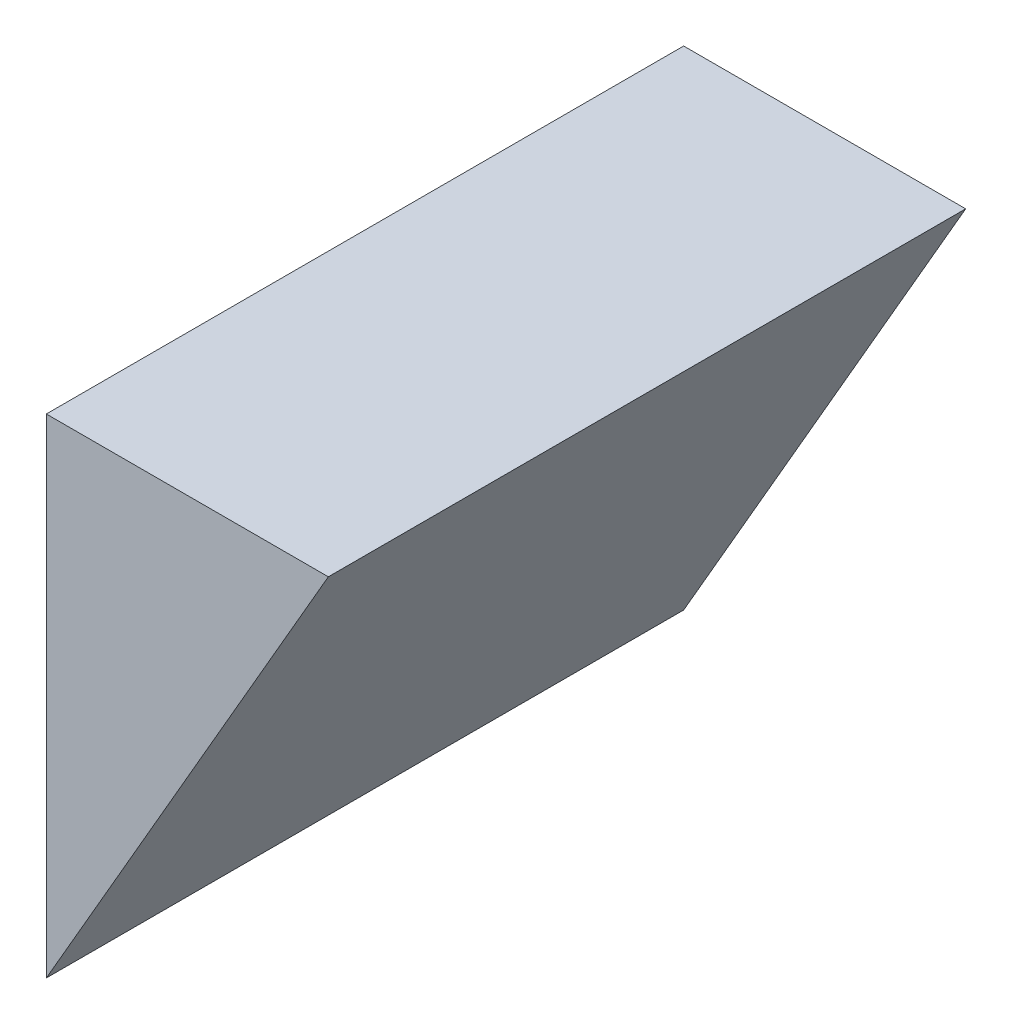
ISO-10303-21;
HEADER;
FILE_DESCRIPTION(('STEP AP214'),'2;1');
FILE_NAME('part.step','',(''),(''),'','','');
FILE_SCHEMA(('AUTOMOTIVE_DESIGN { 1 0 10303 214 1 1 1 1 }'));
ENDSEC;
DATA;
#1=APPLICATION_CONTEXT('core data for automotive mechanical design processes');
#2=APPLICATION_PROTOCOL_DEFINITION('international standard','automotive_design',2000,#1);
#3=PRODUCT_CONTEXT('',#1,'mechanical');
#4=PRODUCT('Part','Part','',(#3));
#5=PRODUCT_RELATED_PRODUCT_CATEGORY('part','',(#4));
#6=PRODUCT_DEFINITION_FORMATION('','',#4);
#7=PRODUCT_DEFINITION_CONTEXT('part definition',#1,'design');
#8=PRODUCT_DEFINITION('design','',#6,#7);
#9=PRODUCT_DEFINITION_SHAPE('','',#8);
#10=(LENGTH_UNIT() NAMED_UNIT(*) SI_UNIT(.MILLI.,.METRE.));
#11=(NAMED_UNIT(*) PLANE_ANGLE_UNIT() SI_UNIT($,.RADIAN.));
#12=(NAMED_UNIT(*) SI_UNIT($,.STERADIAN.) SOLID_ANGLE_UNIT());
#13=UNCERTAINTY_MEASURE_WITH_UNIT(LENGTH_MEASURE(1.E-05),#10,'distance_accuracy_value','');
#14=(GEOMETRIC_REPRESENTATION_CONTEXT(3) GLOBAL_UNCERTAINTY_ASSIGNED_CONTEXT((#13)) GLOBAL_UNIT_ASSIGNED_CONTEXT((#10,
#11,#12)) REPRESENTATION_CONTEXT('',''));
#15=CARTESIAN_POINT('',(0.,0.,0.));
#16=DIRECTION('',(0.,0.,1.));
#17=DIRECTION('',(1.,0.,0.));
#18=AXIS2_PLACEMENT_3D('',#15,#16,#17);
#19=CARTESIAN_POINT('',(17.39,0.,39.3));
#20=DIRECTION('',(0.,-1.,0.));
#21=DIRECTION('',(1.,0.,0.));
#22=AXIS2_PLACEMENT_3D('',#19,#20,#21);
#23=PLANE('',#22);
#24=DIRECTION('',(-1.,0.,0.));
#25=VECTOR('',#24,1.);
#26=CARTESIAN_POINT('',(17.39,0.,0.));
#27=LINE('',#26,#25);
#28=CARTESIAN_POINT('',(17.39,0.,0.));
#29=VERTEX_POINT('',#28);
#30=CARTESIAN_POINT('',(0.,0.,0.));
#31=VERTEX_POINT('',#30);
#32=EDGE_CURVE('E95',#29,#31,#27,.T.);
#33=ORIENTED_EDGE('',*,*,#32,.T.);
#34=DIRECTION('',(0.,0.,-1.));
#35=VECTOR('',#34,1.);
#36=CARTESIAN_POINT('',(0.,0.,39.3));
#37=LINE('',#36,#35);
#38=CARTESIAN_POINT('',(0.,0.,39.3));
#39=VERTEX_POINT('',#38);
#40=EDGE_CURVE('E11',#39,#31,#37,.T.);
#41=ORIENTED_EDGE('',*,*,#40,.F.);
#42=DIRECTION('',(-1.,0.,0.));
#43=VECTOR('',#42,1.);
#44=CARTESIAN_POINT('',(17.39,0.,39.3));
#45=LINE('',#44,#43);
#46=CARTESIAN_POINT('',(17.39,0.,39.3));
#47=VERTEX_POINT('',#46);
#48=EDGE_CURVE('E87',#47,#39,#45,.T.);
#49=ORIENTED_EDGE('',*,*,#48,.F.);
#50=DIRECTION('',(0.,0.,-1.));
#51=VECTOR('',#50,1.);
#52=CARTESIAN_POINT('',(17.39,0.,39.3));
#53=LINE('',#52,#51);
#54=EDGE_CURVE('E96',#47,#29,#53,.T.);
#55=ORIENTED_EDGE('',*,*,#54,.T.);
#56=EDGE_LOOP('',(#33,#41,#49,#55));
#57=FACE_BOUND('',#56,.T.);
#58=ADVANCED_FACE('F45',(#57),#23,.F.);
#59=CARTESIAN_POINT('',(0.,0.,39.3));
#60=DIRECTION('',(1.,0.,0.));
#61=DIRECTION('',(0.,1.,0.));
#62=AXIS2_PLACEMENT_3D('',#59,#60,#61);
#63=PLANE('',#62);
#64=DIRECTION('',(0.,-1.,0.));
#65=VECTOR('',#64,1.);
#66=CARTESIAN_POINT('',(0.,0.,0.));
#67=LINE('',#66,#65);
#68=CARTESIAN_POINT('',(0.,-30.1203635436232,0.));
#69=VERTEX_POINT('',#68);
#70=EDGE_CURVE('E74',#31,#69,#67,.T.);
#71=ORIENTED_EDGE('',*,*,#70,.T.);
#72=DIRECTION('',(0.,0.,-1.));
#73=VECTOR('',#72,1.);
#74=CARTESIAN_POINT('',(0.,-30.1203635436232,39.3));
#75=LINE('',#74,#73);
#76=CARTESIAN_POINT('',(0.,-30.1203635436232,39.3));
#77=VERTEX_POINT('',#76);
#78=EDGE_CURVE('E54',#77,#69,#75,.T.);
#79=ORIENTED_EDGE('',*,*,#78,.F.);
#80=DIRECTION('',(0.,-1.,0.));
#81=VECTOR('',#80,1.);
#82=CARTESIAN_POINT('',(0.,0.,39.3));
#83=LINE('',#82,#81);
#84=EDGE_CURVE('E82',#39,#77,#83,.T.);
#85=ORIENTED_EDGE('',*,*,#84,.F.);
#86=ORIENTED_EDGE('',*,*,#40,.T.);
#87=EDGE_LOOP('',(#71,#79,#85,#86));
#88=FACE_BOUND('',#87,.T.);
#89=ADVANCED_FACE('F83',(#88),#63,.F.);
#90=CARTESIAN_POINT('',(0.,-30.1203635436232,39.3));
#91=DIRECTION('',(-0.866025403784442,0.499999999999995,0.));
#92=DIRECTION('',(-0.499999999999995,-0.866025403784442,0.));
#93=AXIS2_PLACEMENT_3D('',#90,#91,#92);
#94=PLANE('',#93);
#95=DIRECTION('',(0.499999999999995,0.866025403784442,0.));
#96=VECTOR('',#95,1.);
#97=CARTESIAN_POINT('',(0.,-30.1203635436232,0.));
#98=LINE('',#97,#96);
#99=EDGE_CURVE('E79',#69,#29,#98,.T.);
#100=ORIENTED_EDGE('',*,*,#99,.T.);
#101=ORIENTED_EDGE('',*,*,#54,.F.);
#102=DIRECTION('',(0.499999999999995,0.866025403784442,0.));
#103=VECTOR('',#102,1.);
#104=CARTESIAN_POINT('',(0.,-30.1203635436232,39.3));
#105=LINE('',#104,#103);
#106=EDGE_CURVE('E62',#77,#47,#105,.T.);
#107=ORIENTED_EDGE('',*,*,#106,.F.);
#108=ORIENTED_EDGE('',*,*,#78,.T.);
#109=EDGE_LOOP('',(#100,#101,#107,#108));
#110=FACE_BOUND('',#109,.T.);
#111=ADVANCED_FACE('F108',(#110),#94,.F.);
#112=CARTESIAN_POINT('',(0.,0.,39.3));
#113=DIRECTION('',(0.,0.,1.));
#114=DIRECTION('',(1.,0.,0.));
#115=AXIS2_PLACEMENT_3D('',#112,#113,#114);
#116=PLANE('',#115);
#117=ORIENTED_EDGE('',*,*,#48,.T.);
#118=ORIENTED_EDGE('',*,*,#84,.T.);
#119=ORIENTED_EDGE('',*,*,#106,.T.);
#120=EDGE_LOOP('',(#117,#118,#119));
#121=FACE_BOUND('',#120,.T.);
#122=ADVANCED_FACE('F90',(#121),#116,.T.);
#123=CARTESIAN_POINT('',(0.,0.,0.));
#124=DIRECTION('',(0.,0.,1.));
#125=DIRECTION('',(1.,0.,0.));
#126=AXIS2_PLACEMENT_3D('',#123,#124,#125);
#127=PLANE('',#126);
#128=ORIENTED_EDGE('',*,*,#32,.F.);
#129=ORIENTED_EDGE('',*,*,#99,.F.);
#130=ORIENTED_EDGE('',*,*,#70,.F.);
#131=EDGE_LOOP('',(#128,#129,#130));
#132=FACE_BOUND('',#131,.T.);
#133=ADVANCED_FACE('F109',(#132),#127,.F.);
#134=CLOSED_SHELL('',(#58,#89,#111,#122,#133));
#135=MANIFOLD_SOLID_BREP('B2',#134);
#136=ADVANCED_BREP_SHAPE_REPRESENTATION('',(#18,#135),#14);
#137=SHAPE_DEFINITION_REPRESENTATION(#9,#136);
ENDSEC;
END-ISO-10303-21;
